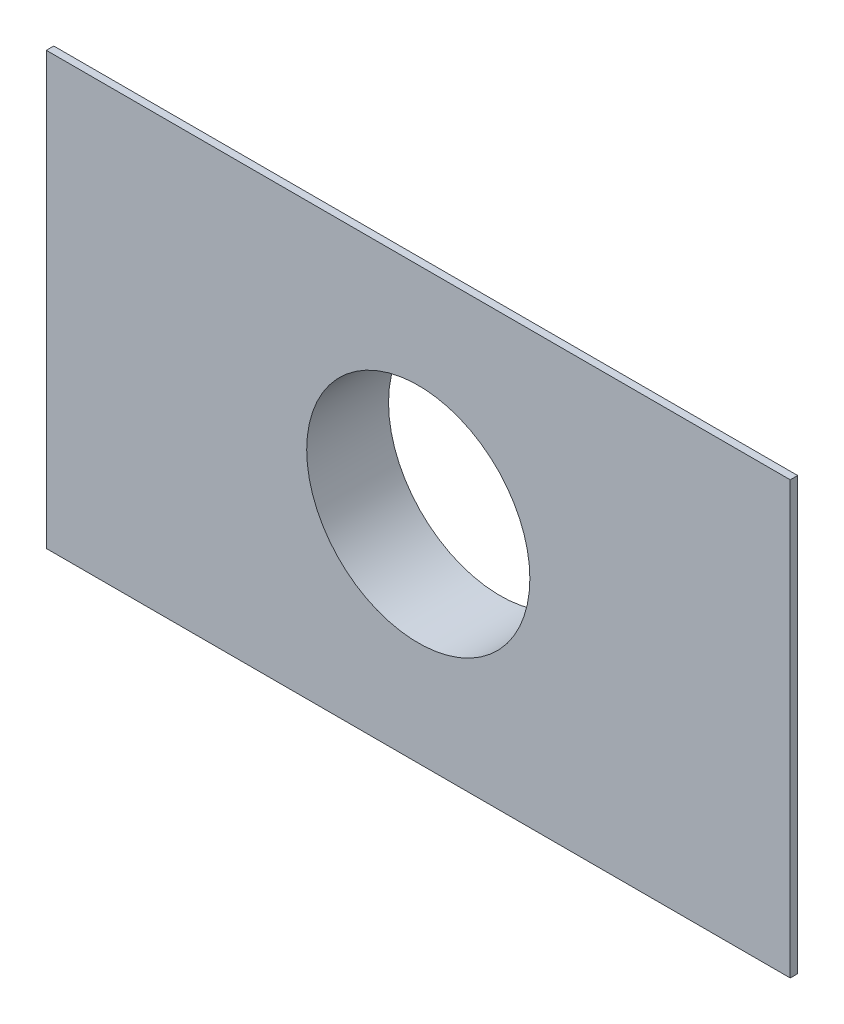
ISO-10303-21;
HEADER;
FILE_DESCRIPTION(('STEP AP214'),'2;1');
FILE_NAME('part.step','',(''),(''),'','','');
FILE_SCHEMA(('AUTOMOTIVE_DESIGN { 1 0 10303 214 1 1 1 1 }'));
ENDSEC;
DATA;
#1=APPLICATION_CONTEXT('core data for automotive mechanical design processes');
#2=APPLICATION_PROTOCOL_DEFINITION('international standard','automotive_design',2000,#1);
#3=PRODUCT_CONTEXT('',#1,'mechanical');
#4=PRODUCT('Part','Part','',(#3));
#5=PRODUCT_RELATED_PRODUCT_CATEGORY('part','',(#4));
#6=PRODUCT_DEFINITION_FORMATION('','',#4);
#7=PRODUCT_DEFINITION_CONTEXT('part definition',#1,'design');
#8=PRODUCT_DEFINITION('design','',#6,#7);
#9=PRODUCT_DEFINITION_SHAPE('','',#8);
#10=(LENGTH_UNIT() NAMED_UNIT(*) SI_UNIT(.MILLI.,.METRE.));
#11=(NAMED_UNIT(*) PLANE_ANGLE_UNIT() SI_UNIT($,.RADIAN.));
#12=(NAMED_UNIT(*) SI_UNIT($,.STERADIAN.) SOLID_ANGLE_UNIT());
#13=UNCERTAINTY_MEASURE_WITH_UNIT(LENGTH_MEASURE(1.E-05),#10,'distance_accuracy_value','');
#14=(GEOMETRIC_REPRESENTATION_CONTEXT(3) GLOBAL_UNCERTAINTY_ASSIGNED_CONTEXT((#13)) GLOBAL_UNIT_ASSIGNED_CONTEXT((#10,
#11,#12)) REPRESENTATION_CONTEXT('',''));
#15=CARTESIAN_POINT('',(0.,0.,0.));
#16=DIRECTION('',(0.,0.,1.));
#17=DIRECTION('',(1.,0.,0.));
#18=AXIS2_PLACEMENT_3D('',#15,#16,#17);
#19=CARTESIAN_POINT('',(0.,0.,0.));
#20=DIRECTION('',(0.,0.,1.));
#21=DIRECTION('',(1.,0.,0.));
#22=AXIS2_PLACEMENT_3D('',#19,#20,#21);
#23=PLANE('',#22);
#24=DIRECTION('',(0.,-1.,0.));
#25=VECTOR('',#24,1.);
#26=CARTESIAN_POINT('',(-102.330233128441,102.845512273942,0.));
#27=LINE('',#26,#25);
#28=CARTESIAN_POINT('',(-102.330233128441,102.845512273942,0.));
#29=VERTEX_POINT('',#28);
#30=CARTESIAN_POINT('',(-102.330233128441,-13.154487726058,0.));
#31=VERTEX_POINT('',#30);
#32=EDGE_CURVE('E101',#29,#31,#27,.T.);
#33=ORIENTED_EDGE('',*,*,#32,.F.);
#34=DIRECTION('',(-1.,0.,0.));
#35=VECTOR('',#34,1.);
#36=CARTESIAN_POINT('',(-102.330233128441,102.845512273942,0.));
#37=LINE('',#36,#35);
#38=CARTESIAN_POINT('',(97.6697668715588,102.845512273942,0.));
#39=VERTEX_POINT('',#38);
#40=EDGE_CURVE('E73',#39,#29,#37,.T.);
#41=ORIENTED_EDGE('',*,*,#40,.F.);
#42=DIRECTION('',(0.,1.,0.));
#43=VECTOR('',#42,1.);
#44=CARTESIAN_POINT('',(97.6697668715588,102.845512273942,0.));
#45=LINE('',#44,#43);
#46=CARTESIAN_POINT('',(97.6697668715588,-13.154487726058,0.));
#47=VERTEX_POINT('',#46);
#48=EDGE_CURVE('E67',#47,#39,#45,.T.);
#49=ORIENTED_EDGE('',*,*,#48,.F.);
#50=DIRECTION('',(1.,0.,0.));
#51=VECTOR('',#50,1.);
#52=CARTESIAN_POINT('',(-102.330233128441,-13.154487726058,0.));
#53=LINE('',#52,#51);
#54=EDGE_CURVE('E92',#31,#47,#53,.T.);
#55=ORIENTED_EDGE('',*,*,#54,.F.);
#56=EDGE_LOOP('',(#33,#41,#49,#55));
#57=FACE_BOUND('',#56,.T.);
#58=CARTESIAN_POINT('',(-2.33023312844122,44.845512273942,0.));
#59=DIRECTION('',(0.,0.,1.));
#60=DIRECTION('',(1.,0.,0.));
#61=AXIS2_PLACEMENT_3D('',#58,#59,#60);
#62=CIRCLE('',#61,32.);
#63=CARTESIAN_POINT('',(29.6697668715588,44.845512273942,0.));
#64=VERTEX_POINT('',#63);
#65=EDGE_CURVE('E11',#64,#64,#62,.F.);
#66=ORIENTED_EDGE('',*,*,#65,.F.);
#67=EDGE_LOOP('',(#66));
#68=FACE_BOUND('',#67,.T.);
#69=ADVANCED_FACE('F33',(#57,#68),#23,.F.);
#70=CARTESIAN_POINT('',(0.,0.,2.));
#71=DIRECTION('',(0.,0.,1.));
#72=DIRECTION('',(1.,0.,0.));
#73=AXIS2_PLACEMENT_3D('',#70,#71,#72);
#74=PLANE('',#73);
#75=DIRECTION('',(0.,-1.,0.));
#76=VECTOR('',#75,1.);
#77=CARTESIAN_POINT('',(-102.330233128441,102.845512273942,2.));
#78=LINE('',#77,#76);
#79=CARTESIAN_POINT('',(-102.330233128441,102.845512273942,2.));
#80=VERTEX_POINT('',#79);
#81=CARTESIAN_POINT('',(-102.330233128441,-13.154487726058,2.));
#82=VERTEX_POINT('',#81);
#83=EDGE_CURVE('E87',#80,#82,#78,.T.);
#84=ORIENTED_EDGE('',*,*,#83,.T.);
#85=DIRECTION('',(1.,0.,0.));
#86=VECTOR('',#85,1.);
#87=CARTESIAN_POINT('',(-102.330233128441,-13.154487726058,2.));
#88=LINE('',#87,#86);
#89=CARTESIAN_POINT('',(97.6697668715588,-13.154487726058,2.));
#90=VERTEX_POINT('',#89);
#91=EDGE_CURVE('E81',#82,#90,#88,.T.);
#92=ORIENTED_EDGE('',*,*,#91,.T.);
#93=DIRECTION('',(0.,1.,0.));
#94=VECTOR('',#93,1.);
#95=CARTESIAN_POINT('',(97.6697668715588,102.845512273942,2.));
#96=LINE('',#95,#94);
#97=CARTESIAN_POINT('',(97.6697668715588,102.845512273942,2.));
#98=VERTEX_POINT('',#97);
#99=EDGE_CURVE('E85',#90,#98,#96,.T.);
#100=ORIENTED_EDGE('',*,*,#99,.T.);
#101=DIRECTION('',(-1.,0.,0.));
#102=VECTOR('',#101,1.);
#103=CARTESIAN_POINT('',(-102.330233128441,102.845512273942,2.));
#104=LINE('',#103,#102);
#105=EDGE_CURVE('E50',#98,#80,#104,.T.);
#106=ORIENTED_EDGE('',*,*,#105,.T.);
#107=EDGE_LOOP('',(#84,#92,#100,#106));
#108=FACE_BOUND('',#107,.T.);
#109=CARTESIAN_POINT('',(-2.33023312844122,44.845512273942,2.));
#110=DIRECTION('',(0.,0.,1.));
#111=DIRECTION('',(1.,0.,0.));
#112=AXIS2_PLACEMENT_3D('',#109,#110,#111);
#113=CIRCLE('',#112,30.);
#114=CARTESIAN_POINT('',(27.6697668715588,44.845512273942,2.));
#115=VERTEX_POINT('',#114);
#116=EDGE_CURVE('E104',#115,#115,#113,.T.);
#117=ORIENTED_EDGE('',*,*,#116,.F.);
#118=EDGE_LOOP('',(#117));
#119=FACE_BOUND('',#118,.T.);
#120=ADVANCED_FACE('F82',(#108,#119),#74,.T.);
#121=CARTESIAN_POINT('',(-102.330233128441,102.845512273942,2.));
#122=DIRECTION('',(1.,0.,0.));
#123=DIRECTION('',(0.,0.,-1.));
#124=AXIS2_PLACEMENT_3D('',#121,#122,#123);
#125=PLANE('',#124);
#126=ORIENTED_EDGE('',*,*,#32,.T.);
#127=DIRECTION('',(0.,0.,-1.));
#128=VECTOR('',#127,1.);
#129=CARTESIAN_POINT('',(-102.330233128441,-13.154487726058,2.));
#130=LINE('',#129,#128);
#131=EDGE_CURVE('E42',#82,#31,#130,.T.);
#132=ORIENTED_EDGE('',*,*,#131,.F.);
#133=ORIENTED_EDGE('',*,*,#83,.F.);
#134=DIRECTION('',(0.,0.,-1.));
#135=VECTOR('',#134,1.);
#136=CARTESIAN_POINT('',(-102.330233128441,102.845512273942,2.));
#137=LINE('',#136,#135);
#138=EDGE_CURVE('E97',#80,#29,#137,.T.);
#139=ORIENTED_EDGE('',*,*,#138,.T.);
#140=EDGE_LOOP('',(#126,#132,#133,#139));
#141=FACE_BOUND('',#140,.T.);
#142=ADVANCED_FACE('F35',(#141),#125,.F.);
#143=CARTESIAN_POINT('',(-102.330233128441,-13.154487726058,2.));
#144=DIRECTION('',(0.,1.,0.));
#145=DIRECTION('',(0.,0.,1.));
#146=AXIS2_PLACEMENT_3D('',#143,#144,#145);
#147=PLANE('',#146);
#148=ORIENTED_EDGE('',*,*,#54,.T.);
#149=DIRECTION('',(0.,0.,-1.));
#150=VECTOR('',#149,1.);
#151=CARTESIAN_POINT('',(97.6697668715588,-13.154487726058,2.));
#152=LINE('',#151,#150);
#153=EDGE_CURVE('E90',#90,#47,#152,.T.);
#154=ORIENTED_EDGE('',*,*,#153,.F.);
#155=ORIENTED_EDGE('',*,*,#91,.F.);
#156=ORIENTED_EDGE('',*,*,#131,.T.);
#157=EDGE_LOOP('',(#148,#154,#155,#156));
#158=FACE_BOUND('',#157,.T.);
#159=ADVANCED_FACE('F91',(#158),#147,.F.);
#160=CARTESIAN_POINT('',(97.6697668715588,102.845512273942,2.));
#161=DIRECTION('',(-1.,0.,0.));
#162=DIRECTION('',(0.,0.,1.));
#163=AXIS2_PLACEMENT_3D('',#160,#161,#162);
#164=PLANE('',#163);
#165=ORIENTED_EDGE('',*,*,#48,.T.);
#166=DIRECTION('',(0.,0.,-1.));
#167=VECTOR('',#166,1.);
#168=CARTESIAN_POINT('',(97.6697668715588,102.845512273942,2.));
#169=LINE('',#168,#167);
#170=EDGE_CURVE('E93',#98,#39,#169,.T.);
#171=ORIENTED_EDGE('',*,*,#170,.F.);
#172=ORIENTED_EDGE('',*,*,#99,.F.);
#173=ORIENTED_EDGE('',*,*,#153,.T.);
#174=EDGE_LOOP('',(#165,#171,#172,#173));
#175=FACE_BOUND('',#174,.T.);
#176=ADVANCED_FACE('F95',(#175),#164,.F.);
#177=CARTESIAN_POINT('',(-102.330233128441,102.845512273942,2.));
#178=DIRECTION('',(0.,-1.,0.));
#179=DIRECTION('',(0.,0.,-1.));
#180=AXIS2_PLACEMENT_3D('',#177,#178,#179);
#181=PLANE('',#180);
#182=ORIENTED_EDGE('',*,*,#40,.T.);
#183=ORIENTED_EDGE('',*,*,#138,.F.);
#184=ORIENTED_EDGE('',*,*,#105,.F.);
#185=ORIENTED_EDGE('',*,*,#170,.T.);
#186=EDGE_LOOP('',(#182,#183,#184,#185));
#187=FACE_BOUND('',#186,.T.);
#188=ADVANCED_FACE('F132',(#187),#181,.F.);
#189=CARTESIAN_POINT('',(-2.33023312844122,44.845512273942,2.));
#190=DIRECTION('',(0.,0.,-1.));
#191=DIRECTION('',(-1.,0.,0.));
#192=AXIS2_PLACEMENT_3D('',#189,#190,#191);
#193=CYLINDRICAL_SURFACE('',#192,30.);
#194=ORIENTED_EDGE('',*,*,#116,.T.);
#195=EDGE_LOOP('',(#194));
#196=FACE_BOUND('',#195,.T.);
#197=CARTESIAN_POINT('',(-2.33023312844122,44.845512273942,-20.));
#198=DIRECTION('',(0.,0.,-1.));
#199=DIRECTION('',(-1.,0.,0.));
#200=AXIS2_PLACEMENT_3D('',#197,#198,#199);
#201=CIRCLE('',#200,30.);
#202=CARTESIAN_POINT('',(-32.3302331284412,44.845512273942,-20.));
#203=VERTEX_POINT('',#202);
#204=EDGE_CURVE('E201',#203,#203,#201,.T.);
#205=ORIENTED_EDGE('',*,*,#204,.T.);
#206=EDGE_LOOP('',(#205));
#207=FACE_BOUND('',#206,.T.);
#208=ADVANCED_FACE('F125',(#196,#207),#193,.F.);
#209=CARTESIAN_POINT('',(-2.33023312844122,44.845512273942,-20.));
#210=DIRECTION('',(0.,0.,-1.));
#211=DIRECTION('',(-1.,0.,0.));
#212=AXIS2_PLACEMENT_3D('',#209,#210,#211);
#213=PLANE('',#212);
#214=CARTESIAN_POINT('',(-2.33023312844122,44.845512273942,-20.));
#215=DIRECTION('',(0.,0.,-1.));
#216=DIRECTION('',(-1.,0.,0.));
#217=AXIS2_PLACEMENT_3D('',#214,#215,#216);
#218=CIRCLE('',#217,32.);
#219=CARTESIAN_POINT('',(-34.3302331284412,44.845512273942,-20.));
#220=VERTEX_POINT('',#219);
#221=EDGE_CURVE('E203',#220,#220,#218,.T.);
#222=ORIENTED_EDGE('',*,*,#221,.T.);
#223=EDGE_LOOP('',(#222));
#224=FACE_BOUND('',#223,.T.);
#225=ORIENTED_EDGE('',*,*,#204,.F.);
#226=EDGE_LOOP('',(#225));
#227=FACE_BOUND('',#226,.T.);
#228=ADVANCED_FACE('F119',(#224,#227),#213,.T.);
#229=CARTESIAN_POINT('',(-2.33023312844122,44.845512273942,-20.));
#230=DIRECTION('',(0.,0.,1.));
#231=DIRECTION('',(1.,0.,0.));
#232=AXIS2_PLACEMENT_3D('',#229,#230,#231);
#233=CYLINDRICAL_SURFACE('',#232,32.);
#234=ORIENTED_EDGE('',*,*,#221,.F.);
#235=EDGE_LOOP('',(#234));
#236=FACE_BOUND('',#235,.T.);
#237=ORIENTED_EDGE('',*,*,#65,.T.);
#238=EDGE_LOOP('',(#237));
#239=FACE_BOUND('',#238,.T.);
#240=ADVANCED_FACE('F117',(#236,#239),#233,.T.);
#241=CLOSED_SHELL('',(#69,#120,#142,#159,#176,#188,#208,#228,#240));
#242=MANIFOLD_SOLID_BREP('B2',#241);
#243=ADVANCED_BREP_SHAPE_REPRESENTATION('',(#18,#242),#14);
#244=SHAPE_DEFINITION_REPRESENTATION(#9,#243);
ENDSEC;
END-ISO-10303-21;
